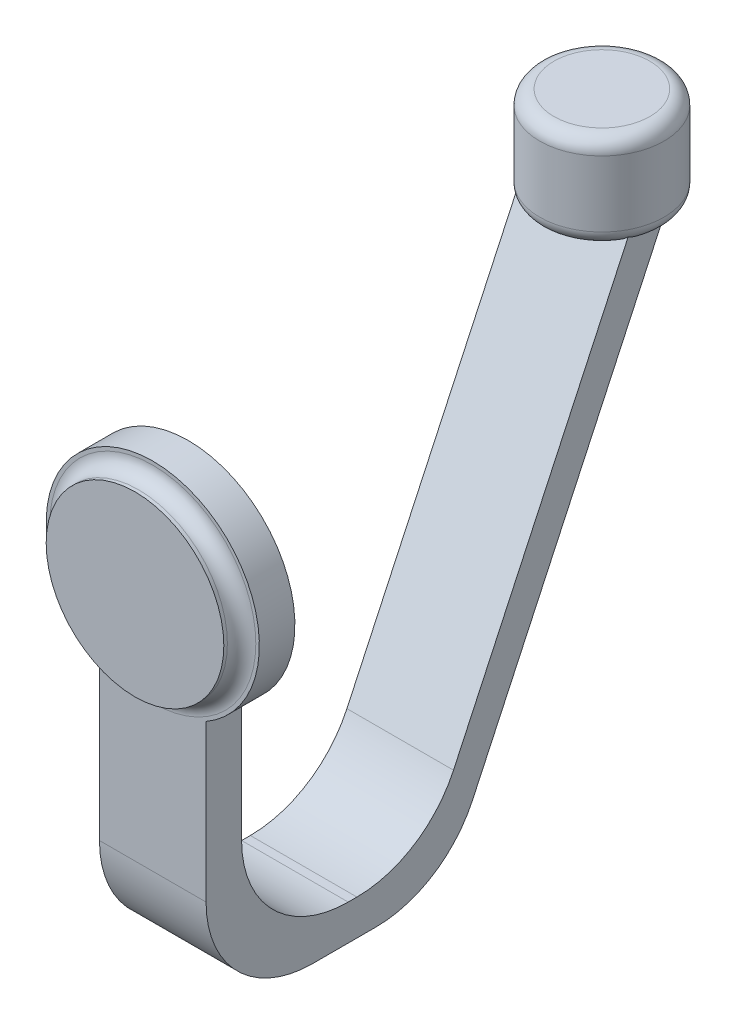
ISO-10303-21;
HEADER;
FILE_DESCRIPTION(('STEP AP214'),'2;1');
FILE_NAME('part.step','',(''),(''),'','','');
FILE_SCHEMA(('AUTOMOTIVE_DESIGN { 1 0 10303 214 1 1 1 1 }'));
ENDSEC;
DATA;
#1=APPLICATION_CONTEXT('core data for automotive mechanical design processes');
#2=APPLICATION_PROTOCOL_DEFINITION('international standard','automotive_design',2000,#1);
#3=PRODUCT_CONTEXT('',#1,'mechanical');
#4=PRODUCT('Part','Part','',(#3));
#5=PRODUCT_RELATED_PRODUCT_CATEGORY('part','',(#4));
#6=PRODUCT_DEFINITION_FORMATION('','',#4);
#7=PRODUCT_DEFINITION_CONTEXT('part definition',#1,'design');
#8=PRODUCT_DEFINITION('design','',#6,#7);
#9=PRODUCT_DEFINITION_SHAPE('','',#8);
#10=(LENGTH_UNIT() NAMED_UNIT(*) SI_UNIT(.MILLI.,.METRE.));
#11=(NAMED_UNIT(*) PLANE_ANGLE_UNIT() SI_UNIT($,.RADIAN.));
#12=(NAMED_UNIT(*) SI_UNIT($,.STERADIAN.) SOLID_ANGLE_UNIT());
#13=UNCERTAINTY_MEASURE_WITH_UNIT(LENGTH_MEASURE(1.E-05),#10,'distance_accuracy_value','');
#14=(GEOMETRIC_REPRESENTATION_CONTEXT(3) GLOBAL_UNCERTAINTY_ASSIGNED_CONTEXT((#13)) GLOBAL_UNIT_ASSIGNED_CONTEXT((#10,
#11,#12)) REPRESENTATION_CONTEXT('',''));
#15=CARTESIAN_POINT('',(0.,0.,0.));
#16=DIRECTION('',(0.,0.,1.));
#17=DIRECTION('',(1.,0.,0.));
#18=AXIS2_PLACEMENT_3D('',#15,#16,#17);
#19=CARTESIAN_POINT('',(470.,57.5,85.));
#20=DIRECTION('',(0.,1.,0.));
#21=DIRECTION('',(0.,0.,1.));
#22=AXIS2_PLACEMENT_3D('',#19,#20,#21);
#23=PLANE('',#22);
#24=CARTESIAN_POINT('',(0.,57.5,0.));
#25=DIRECTION('',(0.,1.,0.));
#26=DIRECTION('',(0.,0.,1.));
#27=AXIS2_PLACEMENT_3D('',#24,#25,#26);
#28=CIRCLE('',#27,13.5);
#29=CARTESIAN_POINT('',(0.,57.5,13.5));
#30=VERTEX_POINT('',#29);
#31=EDGE_CURVE('E241',#30,#30,#28,.T.);
#32=ORIENTED_EDGE('',*,*,#31,.T.);
#33=EDGE_LOOP('',(#32));
#34=FACE_BOUND('',#33,.T.);
#35=ADVANCED_FACE('F40',(#34),#23,.T.);
#36=CARTESIAN_POINT('',(0.,53.5,0.));
#37=DIRECTION('',(0.,1.,0.));
#38=DIRECTION('',(0.,0.,1.));
#39=AXIS2_PLACEMENT_3D('',#36,#37,#38);
#40=TOROIDAL_SURFACE('',#39,13.5,4.);
#41=CARTESIAN_POINT('',(0.,53.5,0.));
#42=DIRECTION('',(0.,1.,0.));
#43=DIRECTION('',(0.,0.,1.));
#44=AXIS2_PLACEMENT_3D('',#41,#42,#43);
#45=CIRCLE('',#44,17.5);
#46=CARTESIAN_POINT('',(0.,53.5,17.5));
#47=VERTEX_POINT('',#46);
#48=EDGE_CURVE('E247',#47,#47,#45,.F.);
#49=ORIENTED_EDGE('',*,*,#48,.F.);
#50=EDGE_LOOP('',(#49));
#51=FACE_BOUND('',#50,.T.);
#52=ORIENTED_EDGE('',*,*,#31,.F.);
#53=EDGE_LOOP('',(#52));
#54=FACE_BOUND('',#53,.T.);
#55=ADVANCED_FACE('F355',(#51,#54),#40,.T.);
#56=CARTESIAN_POINT('',(0.,106.997474683058,0.));
#57=DIRECTION('',(0.,-1.,0.));
#58=DIRECTION('',(0.,0.,-1.));
#59=AXIS2_PLACEMENT_3D('',#56,#57,#58);
#60=CYLINDRICAL_SURFACE('',#59,17.5);
#61=ORIENTED_EDGE('',*,*,#48,.T.);
#62=EDGE_LOOP('',(#61));
#63=FACE_BOUND('',#62,.T.);
#64=CARTESIAN_POINT('',(0.,34.9681867725985,0.));
#65=DIRECTION('',(0.,1.,0.));
#66=DIRECTION('',(0.,0.,1.));
#67=AXIS2_PLACEMENT_3D('',#64,#65,#66);
#68=CIRCLE('',#67,17.5);
#69=CARTESIAN_POINT('',(0.,34.9681867725985,17.5));
#70=VERTEX_POINT('',#69);
#71=EDGE_CURVE('E244',#70,#70,#68,.T.);
#72=ORIENTED_EDGE('',*,*,#71,.T.);
#73=EDGE_LOOP('',(#72));
#74=FACE_BOUND('',#73,.T.);
#75=ADVANCED_FACE('F361',(#63,#74),#60,.T.);
#76=CARTESIAN_POINT('',(0.,30.9681867725985,0.));
#77=DIRECTION('',(0.,1.,0.));
#78=DIRECTION('',(0.,0.,1.));
#79=AXIS2_PLACEMENT_3D('',#76,#77,#78);
#80=PLANE('',#79);
#81=DIRECTION('',(-1.,0.,0.));
#82=VECTOR('',#81,1.);
#83=CARTESIAN_POINT('',(164.009461365782,30.9681867725985,8.42853153326353));
#84=LINE('',#83,#82);
#85=CARTESIAN_POINT('',(10.545608384194,30.9681867725985,8.42853153326353));
#86=VERTEX_POINT('',#85);
#87=CARTESIAN_POINT('',(-10.545608384194,30.9681867725985,8.42853153326353));
#88=VERTEX_POINT('',#87);
#89=EDGE_CURVE('E183',#86,#88,#84,.T.);
#90=ORIENTED_EDGE('',*,*,#89,.F.);
#91=CARTESIAN_POINT('',(0.,30.9681867725985,0.));
#92=DIRECTION('',(0.,1.,0.));
#93=DIRECTION('',(0.,0.,1.));
#94=AXIS2_PLACEMENT_3D('',#91,#92,#93);
#95=CIRCLE('',#94,13.5);
#96=EDGE_CURVE('E252',#86,#88,#95,.F.);
#97=ORIENTED_EDGE('',*,*,#96,.T.);
#98=EDGE_LOOP('',(#90,#97));
#99=FACE_BOUND('',#98,.T.);
#100=ADVANCED_FACE('F493',(#99),#80,.F.);
#101=DIRECTION('',(-1.,0.,0.));
#102=VECTOR('',#101,1.);
#103=CARTESIAN_POINT('',(164.009461365782,30.9681867725985,-1.57146846673646));
#104=LINE('',#103,#102);
#105=CARTESIAN_POINT('',(13.4082245975391,30.9681867725985,-1.57146846673646));
#106=VERTEX_POINT('',#105);
#107=CARTESIAN_POINT('',(-13.4082245975391,30.9681867725985,-1.57146846673646));
#108=VERTEX_POINT('',#107);
#109=EDGE_CURVE('E179',#106,#108,#104,.T.);
#110=ORIENTED_EDGE('',*,*,#109,.T.);
#111=CARTESIAN_POINT('',(0.,30.9681867725985,0.));
#112=DIRECTION('',(0.,1.,0.));
#113=DIRECTION('',(0.,0.,1.));
#114=AXIS2_PLACEMENT_3D('',#111,#112,#113);
#115=CIRCLE('',#114,13.5);
#116=EDGE_CURVE('E250',#108,#106,#115,.F.);
#117=ORIENTED_EDGE('',*,*,#116,.T.);
#118=EDGE_LOOP('',(#110,#117));
#119=FACE_BOUND('',#118,.T.);
#120=ADVANCED_FACE('F332',(#119),#80,.F.);
#121=CARTESIAN_POINT('',(0.,34.9681867725985,0.));
#122=DIRECTION('',(0.,1.,0.));
#123=DIRECTION('',(0.,0.,1.));
#124=AXIS2_PLACEMENT_3D('',#121,#122,#123);
#125=TOROIDAL_SURFACE('',#124,13.5,4.);
#126=CARTESIAN_POINT('',(-10.545608384194,30.9681867725985,8.42853153326353));
#127=CARTESIAN_POINT('',(-10.7152312089002,30.968207326589,8.42852194878039));
#128=CARTESIAN_POINT('',(-10.884761049705,30.9747698955943,8.42546177259605));
#129=CARTESIAN_POINT('',(-11.2226090984357,31.0007018072022,8.41336952362265));
#130=CARTESIAN_POINT('',(-11.3909274322339,31.0200697993582,8.40433808055725));
#131=CARTESIAN_POINT('',(-11.8933065331305,31.0970794834363,8.36842787511953));
#132=CARTESIAN_POINT('',(-12.2240465200114,31.1736245117423,8.33273434222677));
#133=CARTESIAN_POINT('',(-12.8716683239122,31.3765193566267,8.23812292225702));
#134=CARTESIAN_POINT('',(-13.1882915739955,31.5035508755718,8.17888715214582));
#135=CARTESIAN_POINT('',(-13.6411038903215,31.7291856533687,8.07367192731301));
#136=CARTESIAN_POINT('',(-13.7882449153386,31.8101660781055,8.03591013509759));
#137=CARTESIAN_POINT('',(-14.0741182449924,31.9834781989561,7.95509336589391));
#138=CARTESIAN_POINT('',(-14.2128545512437,32.0758044287277,7.91204093790281));
#139=CARTESIAN_POINT('',(-14.4636220561541,32.25893237927,7.82664697214274));
#140=CARTESIAN_POINT('',(-14.5768074472217,32.3484394096639,7.78490915841131));
#141=CARTESIAN_POINT('',(-14.7948501167143,32.535334883347,7.69775836775838));
#142=CARTESIAN_POINT('',(-14.8997113191615,32.6327195688692,7.6523471431124));
#143=CARTESIAN_POINT('',(-15.,32.7338768594451,7.60517672383865));
#144=B_SPLINE_CURVE_WITH_KNOTS('',3,(#126,#127,#128,#129,#130,#131,#132,#133,#134,#135,#136,
#137,#138,#139,#140,#141,#142,#143),.UNSPECIFIED.,.F.,.F.,(4,2,2,2,2,2,2,2,4),(0.,
0.50854328375544,1.01703294561259,2.03621919814531,3.06966204407253,3.58555545223124,
4.10120127335572,4.55137952087851,5.00134427839677),.UNSPECIFIED.);
#145=CARTESIAN_POINT('',(-15.,32.7338768594451,7.60517672383865));
#146=VERTEX_POINT('',#145);
#147=EDGE_CURVE('E261',#88,#146,#144,.T.);
#148=ORIENTED_EDGE('',*,*,#147,.F.);
#149=ORIENTED_EDGE('',*,*,#96,.F.);
#150=CARTESIAN_POINT('',(15.,32.7338768594451,7.60517672383865));
#151=CARTESIAN_POINT('',(14.8860200659042,32.6189035831155,7.65878964307428));
#152=CARTESIAN_POINT('',(14.7661270916275,32.5088065401462,7.71012873735111));
#153=CARTESIAN_POINT('',(14.5158803655626,32.2989606039281,7.80798150444231));
#154=CARTESIAN_POINT('',(14.3855317171552,32.1992067160765,7.85449750627825));
#155=CARTESIAN_POINT('',(14.1158702449399,32.0107010252015,7.94239915353906));
#156=CARTESIAN_POINT('',(13.9765740848561,31.9219296222046,7.98379393858168));
#157=CARTESIAN_POINT('',(13.6900897992569,31.7556076000142,8.06135117124888));
#158=CARTESIAN_POINT('',(13.542901182616,31.6780576802153,8.09751329274041));
#159=CARTESIAN_POINT('',(13.1063064996948,31.4699455508602,8.19455757241362));
#160=CARTESIAN_POINT('',(12.8079981462975,31.3543964244426,8.2484390149553));
#161=CARTESIAN_POINT('',(12.1953610147218,31.1671507643174,8.33575310022793));
#162=CARTESIAN_POINT('',(11.8810436391301,31.0954234784737,8.36920008291553));
#163=CARTESIAN_POINT('',(11.3945937837726,31.0205159704723,8.40413002754991));
#164=CARTESIAN_POINT('',(11.2253688866602,31.0009612586506,8.41324853942536));
#165=CARTESIAN_POINT('',(10.8859931530864,30.9748175546796,8.42543954879957));
#166=CARTESIAN_POINT('',(10.7158443451619,30.9682068755625,8.4285221590975));
#167=CARTESIAN_POINT('',(10.5456083841939,30.9681867725985,8.42853153326353));
#168=B_SPLINE_CURVE_WITH_KNOTS('',3,(#150,#151,#152,#153,#154,#155,#156,#157,#158,#159,#160,
#161,#162,#163,#164,#165,#166,#167),.UNSPECIFIED.,.F.,.F.,(4,2,2,2,2,2,2,2,4),(0.,
0.511365533940272,1.02248297331922,1.53267466552046,2.04289814244638,3.01178423787931,
3.97998963064112,4.49123985370231,5.0016327715614),.UNSPECIFIED.);
#169=CARTESIAN_POINT('',(15.,32.7338768594451,7.60517672383865));
#170=VERTEX_POINT('',#169);
#171=EDGE_CURVE('E11',#170,#86,#168,.T.);
#172=ORIENTED_EDGE('',*,*,#171,.F.);
#173=CARTESIAN_POINT('',(15.,31.3017294395276,-1.72700196664695));
#174=CARTESIAN_POINT('',(15.,31.2946542438076,-1.58505761140885));
#175=CARTESIAN_POINT('',(15.,31.2885545747367,-1.44306765861311));
#176=CARTESIAN_POINT('',(15.,31.2781857632575,-1.15902399239379));
#177=CARTESIAN_POINT('',(15.,31.2739165780865,-1.01697028053732));
#178=CARTESIAN_POINT('',(15.,31.2636729787802,-0.59072119923288));
#179=CARTESIAN_POINT('',(15.,31.260263651425,-0.306461374374114));
#180=CARTESIAN_POINT('',(15.,31.259923769649,0.263617927047029));
#181=CARTESIAN_POINT('',(15.,31.2630288604999,0.549437404691567));
#182=CARTESIAN_POINT('',(15.,31.2761122053653,1.12091738865747));
#183=CARTESIAN_POINT('',(15.,31.2860902583001,1.40657789938497));
#184=CARTESIAN_POINT('',(15.,31.313417061035,1.96717594736239));
#185=CARTESIAN_POINT('',(15.,31.3304854881255,2.24212678805273));
#186=CARTESIAN_POINT('',(15.,31.3734490546799,2.79133253246845));
#187=CARTESIAN_POINT('',(15.,31.3993433450627,3.06558750058339));
#188=CARTESIAN_POINT('',(15.,31.4620678566855,3.61247112621148));
#189=CARTESIAN_POINT('',(15.,31.4988821622812,3.88510156556343));
#190=CARTESIAN_POINT('',(15.,31.5863034340388,4.4281101068495));
#191=CARTESIAN_POINT('',(15.,31.636905221332,4.69848901528545));
#192=CARTESIAN_POINT('',(15.,31.7471399435721,5.19713214714225));
#193=CARTESIAN_POINT('',(15.,31.8044553446754,5.42590276478388));
#194=CARTESIAN_POINT('',(15.,31.9348028343335,5.87869496916715));
#195=CARTESIAN_POINT('',(15.,32.0078115328978,6.10272308433633));
#196=CARTESIAN_POINT('',(15.,32.1324295460294,6.4349996810594));
#197=CARTESIAN_POINT('',(15.,32.1768769802978,6.54594607314739));
#198=CARTESIAN_POINT('',(15.,32.2712912629136,6.76544058473568));
#199=CARTESIAN_POINT('',(15.,32.3212564068328,6.87398943247663));
#200=CARTESIAN_POINT('',(15.,32.427569547536,7.08863543611227));
#201=CARTESIAN_POINT('',(15.,32.4839488831823,7.19471721293825));
#202=CARTESIAN_POINT('',(15.,32.6035926124073,7.40306754804488));
#203=CARTESIAN_POINT('',(15.,32.6668645529323,7.50533175852156));
#204=CARTESIAN_POINT('',(15.,32.7338768594451,7.60517672383865));
#205=B_SPLINE_CURVE_WITH_KNOTS('',3,(#173,#174,#175,#176,#177,#178,#179,#180,#181,#182,#183,
#184,#185,#186,#187,#188,#189,#190,#191,#192,#193,#194,#195,#196,#197,#198,#199,#200,#201,#202,
#203,#204),.UNSPECIFIED.,.F.,.F.,(4,2,2,2,2,2,2,2,2,2,2,2,2,2,2,4),(0.,0.426353272020604,
0.852696583283366,1.70545373890509,2.56288913542098,3.42029944732787,4.24662618178154,
5.07287344295641,5.89792233781041,6.72266175312848,7.42976812666328,8.13582781588574,
8.49425990841383,8.8525815888568,9.21273595160975,9.57328870035811),.UNSPECIFIED.);
#206=CARTESIAN_POINT('',(15.,31.3017294395277,-1.72700196664696));
#207=VERTEX_POINT('',#206);
#208=EDGE_CURVE('E52',#207,#170,#205,.T.);
#209=ORIENTED_EDGE('',*,*,#208,.F.);
#210=CARTESIAN_POINT('',(13.4082245975391,30.9681867725985,-1.57146846673646));
#211=CARTESIAN_POINT('',(13.5109524327348,30.9681697069459,-1.57146050889192));
#212=CARTESIAN_POINT('',(13.6136871358486,30.9720899175039,-1.57328853309671));
#213=CARTESIAN_POINT('',(13.8184745141127,30.9877937604101,-1.58061135530634));
#214=CARTESIAN_POINT('',(13.9205268137176,30.9995814119703,-1.58610802750053));
#215=CARTESIAN_POINT('',(14.1212372411173,31.0307127723056,-1.60062481923369));
#216=CARTESIAN_POINT('',(14.2199230870676,31.0499098520753,-1.6095765645445));
#217=CARTESIAN_POINT('',(14.4151185043218,31.0957293427794,-1.63094254395256));
#218=CARTESIAN_POINT('',(14.5116293402763,31.1223473118243,-1.64335470676273));
#219=CARTESIAN_POINT('',(14.6735939264869,31.1738303692698,-1.66736165071482));
#220=CARTESIAN_POINT('',(14.7397619719342,31.1968699735062,-1.6781051946111));
#221=CARTESIAN_POINT('',(14.8709338380603,31.2465950604341,-1.70129238344803));
#222=CARTESIAN_POINT('',(14.9359267925488,31.27330409154,-1.71374700919461));
#223=CARTESIAN_POINT('',(15.0000000000001,31.3017294395276,-1.72700196664695));
#224=B_SPLINE_CURVE_WITH_KNOTS('',3,(#210,#211,#212,#213,#214,#215,#216,#217,#218,#219,#220,
#221,#222,#223),.UNSPECIFIED.,.F.,.F.,(4,2,2,2,2,2,4),(0.,0.308103093431711,0.616363707011656,
0.918813264753393,1.22108217383069,1.4336171056132,1.64758591380508),.UNSPECIFIED.);
#225=EDGE_CURVE('E312',#106,#207,#224,.T.);
#226=ORIENTED_EDGE('',*,*,#225,.F.);
#227=ORIENTED_EDGE('',*,*,#116,.F.);
#228=CARTESIAN_POINT('',(-15.,31.3017294395276,-1.72700196664695));
#229=CARTESIAN_POINT('',(-14.9077164653574,31.2607754461643,-1.70790480590959));
#230=CARTESIAN_POINT('',(-14.8134998924318,31.2233935846295,-1.69047335759981));
#231=CARTESIAN_POINT('',(-14.6218988117471,31.1560312657338,-1.65906179242768));
#232=CARTESIAN_POINT('',(-14.5245142998769,31.1260508179786,-1.64508168004451));
#233=CARTESIAN_POINT('',(-14.3291263367313,31.0742393057946,-1.62092157513252));
#234=CARTESIAN_POINT('',(-14.2311687922473,31.0522658736621,-1.61067519545319));
#235=CARTESIAN_POINT('',(-14.0335766741488,31.0158391398089,-1.5936891304959));
#236=CARTESIAN_POINT('',(-13.9339423952548,31.0013845304625,-1.58694883546201));
#237=CARTESIAN_POINT('',(-13.7632047534185,30.9831986592476,-1.57846862444429));
#238=CARTESIAN_POINT('',(-13.6923408265093,30.9775629879052,-1.57584066773849));
#239=CARTESIAN_POINT('',(-13.5503945191005,30.97005629394,-1.5723402388551));
#240=CARTESIAN_POINT('',(-13.4793122208841,30.9681839945673,-1.57146717131924));
#241=CARTESIAN_POINT('',(-13.4082245975392,30.9681867725985,-1.57146846673648));
#242=B_SPLINE_CURVE_WITH_KNOTS('',3,(#228,#229,#230,#231,#232,#233,#234,#235,#236,#237,#238,
#239,#240,#241),.UNSPECIFIED.,.F.,.F.,(4,2,2,2,2,2,4),(0.,0.308171799363888,0.616343998676297,
0.918733285358422,1.22106996482355,1.43436363094255,1.64758492349183),.UNSPECIFIED.);
#243=CARTESIAN_POINT('',(-15.,31.3017294395276,-1.72700196664693));
#244=VERTEX_POINT('',#243);
#245=EDGE_CURVE('E316',#244,#108,#242,.T.);
#246=ORIENTED_EDGE('',*,*,#245,.F.);
#247=CARTESIAN_POINT('',(-15.,32.7338768594451,7.60517672383865));
#248=CARTESIAN_POINT('',(-15.,32.6862002315018,7.53416495154672));
#249=CARTESIAN_POINT('',(-15.,32.6404231023762,7.4619123259332));
#250=CARTESIAN_POINT('',(-15.,32.5524461563186,7.31531142330901));
#251=CARTESIAN_POINT('',(-15.,32.51024438764,7.24096431957436));
#252=CARTESIAN_POINT('',(-15.,32.3888039813336,7.01562866338823));
#253=CARTESIAN_POINT('',(-15.,32.3144869566062,6.86197595558332));
#254=CARTESIAN_POINT('',(-15.,32.1780826120228,6.55152502755692));
#255=CARTESIAN_POINT('',(-15.,32.1158647217561,6.39478314726917));
#256=CARTESIAN_POINT('',(-15.,32.0010682301106,6.07777298548782));
#257=CARTESIAN_POINT('',(-15.,31.9484933421097,5.91750337201349));
#258=CARTESIAN_POINT('',(-15.,31.829094572106,5.519117540483));
#259=CARTESIAN_POINT('',(-15.,31.7670676362749,5.27956954591452));
#260=CARTESIAN_POINT('',(-15.,31.6574686874191,4.79723146085827));
#261=CARTESIAN_POINT('',(-15.,31.6098996051803,4.55444072342565));
#262=CARTESIAN_POINT('',(-15.,31.5263666182455,4.06642409714968));
#263=CARTESIAN_POINT('',(-15.,31.4904252762013,3.82119441442788));
#264=CARTESIAN_POINT('',(-15.,31.4280486196363,3.32958061765078));
#265=CARTESIAN_POINT('',(-15.,31.4016124106377,3.08319661443418));
#266=CARTESIAN_POINT('',(-15.,31.3562159310149,2.58659502530944));
#267=CARTESIAN_POINT('',(-15.,31.3373550618984,2.33636854980331));
#268=CARTESIAN_POINT('',(-15.,31.3062454931197,1.83550867187382));
#269=CARTESIAN_POINT('',(-15.,31.2939969624949,1.58487525921181));
#270=CARTESIAN_POINT('',(-15.,31.275201746329,1.08365883993128));
#271=CARTESIAN_POINT('',(-15.,31.2686492079694,0.83307604671023));
#272=CARTESIAN_POINT('',(-15.,31.2607116465589,0.331840115470572));
#273=CARTESIAN_POINT('',(-15.,31.2593263881142,0.0811869811765705));
#274=CARTESIAN_POINT('',(-15.,31.2610725776303,-0.299902802911347));
#275=CARTESIAN_POINT('',(-15.,31.262356695702,-0.430350457666127));
#276=CARTESIAN_POINT('',(-15.,31.2663309818546,-0.691232158290881));
#277=CARTESIAN_POINT('',(-15.,31.269021227218,-0.821666203018683));
#278=CARTESIAN_POINT('',(-15.,31.2758298152273,-1.08128795248768));
#279=CARTESIAN_POINT('',(-15.,31.2799346951762,-1.21047600772902));
#280=CARTESIAN_POINT('',(-15.,31.2896673672442,-1.46878966613489));
#281=CARTESIAN_POINT('',(-15.,31.2952951017424,-1.59791527147723));
#282=CARTESIAN_POINT('',(-15.,31.3017294395276,-1.72700196664696));
#283=B_SPLINE_CURVE_WITH_KNOTS('',3,(#247,#248,#249,#250,#251,#252,#253,#254,#255,#256,#257,
#258,#259,#260,#261,#262,#263,#264,#265,#266,#267,#268,#269,#270,#271,#272,#273,#274,#275,#276,
#277,#278,#279,#280,#281,#282),.UNSPECIFIED.,.F.,.F.,(4,2,2,2,2,2,2,2,2,2,2,2,2,2,2,2,2,4),(0.,
0.256520464114686,0.512899982159367,1.02433610830708,1.52990251897129,2.03566320892495,
2.77739956915177,3.51928618839149,4.26260386021556,5.00585156402851,5.7585561364535,
6.51127995005916,7.26322939794036,8.01514459056622,8.40650037911286,8.79787767935193,
9.18562875119175,9.57336515356034),.UNSPECIFIED.);
#284=EDGE_CURVE('E267',#146,#244,#283,.T.);
#285=ORIENTED_EDGE('',*,*,#284,.F.);
#286=EDGE_LOOP('',(#148,#149,#172,#209,#226,#227,#246,#285));
#287=FACE_BOUND('',#286,.T.);
#288=ORIENTED_EDGE('',*,*,#71,.F.);
#289=EDGE_LOOP('',(#288));
#290=FACE_BOUND('',#289,.T.);
#291=ADVANCED_FACE('F273',(#287,#290),#125,.T.);
#292=CARTESIAN_POINT('',(164.009461365782,30.9681867725985,8.42853153326353));
#293=DIRECTION('',(0.,0.422618261740697,0.906307787036651));
#294=DIRECTION('',(0.,-0.906307787036651,0.422618261740697));
#295=AXIS2_PLACEMENT_3D('',#292,#293,#294);
#296=PLANE('',#295);
#297=DIRECTION('',(0.,0.906307787036651,-0.422618261740697));
#298=VECTOR('',#297,1.);
#299=CARTESIAN_POINT('',(-15.,30.9681867725985,8.42853153326353));
#300=LINE('',#299,#298);
#301=CARTESIAN_POINT('',(-15.,-72.6785478522209,56.7597976315753));
#302=VERTEX_POINT('',#301);
#303=EDGE_CURVE('E177',#302,#146,#300,.T.);
#304=ORIENTED_EDGE('',*,*,#303,.F.);
#305=DIRECTION('',(-1.,0.,0.));
#306=VECTOR('',#305,1.);
#307=CARTESIAN_POINT('',(164.009461365782,-72.6785478522209,56.7597976315753));
#308=LINE('',#307,#306);
#309=CARTESIAN_POINT('',(15.,-72.6785478522209,56.7597976315754));
#310=VERTEX_POINT('',#309);
#311=EDGE_CURVE('E231',#302,#310,#308,.F.);
#312=ORIENTED_EDGE('',*,*,#311,.T.);
#313=DIRECTION('',(0.,-0.906307787036651,0.422618261740697));
#314=VECTOR('',#313,1.);
#315=CARTESIAN_POINT('',(15.,30.9681867725985,8.42853153326353));
#316=LINE('',#315,#314);
#317=EDGE_CURVE('E58',#170,#310,#316,.T.);
#318=ORIENTED_EDGE('',*,*,#317,.F.);
#319=ORIENTED_EDGE('',*,*,#171,.T.);
#320=ORIENTED_EDGE('',*,*,#89,.T.);
#321=ORIENTED_EDGE('',*,*,#147,.T.);
#322=EDGE_LOOP('',(#304,#312,#318,#319,#320,#321));
#323=FACE_BOUND('',#322,.T.);
#324=ADVANCED_FACE('F276',(#323),#296,.T.);
#325=CARTESIAN_POINT('',(15.,-60.,83.9490312426749));
#326=DIRECTION('',(-1.,0.,0.));
#327=DIRECTION('',(0.,0.,1.));
#328=AXIS2_PLACEMENT_3D('',#325,#326,#327);
#329=CYLINDRICAL_SURFACE('',#328,30.);
#330=CARTESIAN_POINT('',(15.,-60.,83.9490312426749));
#331=DIRECTION('',(-1.,0.,0.));
#332=DIRECTION('',(0.,0.,1.));
#333=AXIS2_PLACEMENT_3D('',#330,#331,#332);
#334=CIRCLE('',#333,30.);
#335=CARTESIAN_POINT('',(15.,-90.,83.9490312426749));
#336=VERTEX_POINT('',#335);
#337=EDGE_CURVE('E239',#310,#336,#334,.T.);
#338=ORIENTED_EDGE('',*,*,#337,.F.);
#339=ORIENTED_EDGE('',*,*,#311,.F.);
#340=CARTESIAN_POINT('',(-15.,-60.,83.9490312426749));
#341=DIRECTION('',(1.,0.,0.));
#342=DIRECTION('',(0.,0.,-1.));
#343=AXIS2_PLACEMENT_3D('',#340,#341,#342);
#344=CIRCLE('',#343,30.);
#345=CARTESIAN_POINT('',(-15.,-90.,83.9490312426749));
#346=VERTEX_POINT('',#345);
#347=EDGE_CURVE('E237',#346,#302,#344,.T.);
#348=ORIENTED_EDGE('',*,*,#347,.F.);
#349=DIRECTION('',(-1.,0.,0.));
#350=VECTOR('',#349,1.);
#351=CARTESIAN_POINT('',(15.,-90.,83.9490312426749));
#352=LINE('',#351,#350);
#353=EDGE_CURVE('E223',#336,#346,#352,.T.);
#354=ORIENTED_EDGE('',*,*,#353,.F.);
#355=EDGE_LOOP('',(#338,#339,#348,#354));
#356=FACE_BOUND('',#355,.T.);
#357=ADVANCED_FACE('F281',(#356),#329,.F.);
#358=CARTESIAN_POINT('',(15.,-90.,59.5));
#359=DIRECTION('',(0.,-1.,0.));
#360=DIRECTION('',(0.,0.,-1.));
#361=AXIS2_PLACEMENT_3D('',#358,#359,#360);
#362=PLANE('',#361);
#363=DIRECTION('',(0.,0.,1.));
#364=VECTOR('',#363,1.);
#365=CARTESIAN_POINT('',(-15.,-90.,59.5));
#366=LINE('',#365,#364);
#367=CARTESIAN_POINT('',(-15.,-90.,86.4));
#368=VERTEX_POINT('',#367);
#369=EDGE_CURVE('E192',#346,#368,#366,.T.);
#370=ORIENTED_EDGE('',*,*,#369,.T.);
#371=DIRECTION('',(1.,0.,0.));
#372=VECTOR('',#371,1.);
#373=CARTESIAN_POINT('',(15.,-90.,86.4));
#374=LINE('',#373,#372);
#375=CARTESIAN_POINT('',(15.,-90.,86.4));
#376=VERTEX_POINT('',#375);
#377=EDGE_CURVE('E226',#368,#376,#374,.T.);
#378=ORIENTED_EDGE('',*,*,#377,.T.);
#379=DIRECTION('',(0.,0.,1.));
#380=VECTOR('',#379,1.);
#381=CARTESIAN_POINT('',(15.,-90.,59.5));
#382=LINE('',#381,#380);
#383=EDGE_CURVE('E189',#336,#376,#382,.T.);
#384=ORIENTED_EDGE('',*,*,#383,.F.);
#385=ORIENTED_EDGE('',*,*,#353,.T.);
#386=EDGE_LOOP('',(#370,#378,#384,#385));
#387=FACE_BOUND('',#386,.T.);
#388=ADVANCED_FACE('F285',(#387),#362,.F.);
#389=CARTESIAN_POINT('',(15.,-60.,86.4));
#390=DIRECTION('',(1.,0.,0.));
#391=DIRECTION('',(0.,0.,-1.));
#392=AXIS2_PLACEMENT_3D('',#389,#390,#391);
#393=CYLINDRICAL_SURFACE('',#392,30.);
#394=CARTESIAN_POINT('',(-15.,-60.,86.4));
#395=DIRECTION('',(1.,0.,0.));
#396=DIRECTION('',(0.,0.,-1.));
#397=AXIS2_PLACEMENT_3D('',#394,#395,#396);
#398=CIRCLE('',#397,30.);
#399=CARTESIAN_POINT('',(-15.,-60.,116.4));
#400=VERTEX_POINT('',#399);
#401=EDGE_CURVE('E235',#400,#368,#398,.T.);
#402=ORIENTED_EDGE('',*,*,#401,.F.);
#403=DIRECTION('',(1.,0.,0.));
#404=VECTOR('',#403,1.);
#405=CARTESIAN_POINT('',(0.,-60.,116.4));
#406=LINE('',#405,#404);
#407=CARTESIAN_POINT('',(15.,-60.,116.4));
#408=VERTEX_POINT('',#407);
#409=EDGE_CURVE('E229',#408,#400,#406,.F.);
#410=ORIENTED_EDGE('',*,*,#409,.F.);
#411=CARTESIAN_POINT('',(15.,-60.,86.4));
#412=DIRECTION('',(-1.,0.,0.));
#413=DIRECTION('',(0.,0.,1.));
#414=AXIS2_PLACEMENT_3D('',#411,#412,#413);
#415=CIRCLE('',#414,30.);
#416=EDGE_CURVE('E233',#376,#408,#415,.T.);
#417=ORIENTED_EDGE('',*,*,#416,.F.);
#418=ORIENTED_EDGE('',*,*,#377,.F.);
#419=EDGE_LOOP('',(#402,#410,#417,#418));
#420=FACE_BOUND('',#419,.T.);
#421=ADVANCED_FACE('F289',(#420),#393,.F.);
#422=CARTESIAN_POINT('',(0.,0.,116.4));
#423=DIRECTION('',(0.,0.,-1.));
#424=DIRECTION('',(-1.,0.,0.));
#425=AXIS2_PLACEMENT_3D('',#422,#423,#424);
#426=PLANE('',#425);
#427=DIRECTION('',(0.,1.,0.));
#428=VECTOR('',#427,1.);
#429=CARTESIAN_POINT('',(15.,-100.,116.4));
#430=LINE('',#429,#428);
#431=CARTESIAN_POINT('',(15.,-25.9807621135332,116.4));
#432=VERTEX_POINT('',#431);
#433=EDGE_CURVE('E201',#408,#432,#430,.T.);
#434=ORIENTED_EDGE('',*,*,#433,.F.);
#435=ORIENTED_EDGE('',*,*,#409,.T.);
#436=DIRECTION('',(0.,1.,0.));
#437=VECTOR('',#436,1.);
#438=CARTESIAN_POINT('',(-15.,-100.,116.4));
#439=LINE('',#438,#437);
#440=CARTESIAN_POINT('',(-15.,-25.9807621135332,116.4));
#441=VERTEX_POINT('',#440);
#442=EDGE_CURVE('E157',#400,#441,#439,.T.);
#443=ORIENTED_EDGE('',*,*,#442,.T.);
#444=CARTESIAN_POINT('',(0.,0.,116.4));
#445=DIRECTION('',(0.,0.,-1.));
#446=DIRECTION('',(-1.,0.,0.));
#447=AXIS2_PLACEMENT_3D('',#444,#445,#446);
#448=CIRCLE('',#447,30.0000000000001);
#449=EDGE_CURVE('E165',#441,#432,#448,.T.);
#450=ORIENTED_EDGE('',*,*,#449,.T.);
#451=EDGE_LOOP('',(#434,#435,#443,#450));
#452=FACE_BOUND('',#451,.T.);
#453=ADVANCED_FACE('F294',(#452),#426,.T.);
#454=CARTESIAN_POINT('',(470.,-100.,85.));
#455=DIRECTION('',(0.,-1.,0.));
#456=DIRECTION('',(0.,0.,-1.));
#457=AXIS2_PLACEMENT_3D('',#454,#455,#456);
#458=PLANE('',#457);
#459=DIRECTION('',(0.,0.,-1.));
#460=VECTOR('',#459,1.);
#461=CARTESIAN_POINT('',(-15.,-100.,116.4));
#462=LINE('',#461,#460);
#463=CARTESIAN_POINT('',(-15.,-100.,96.4));
#464=VERTEX_POINT('',#463);
#465=CARTESIAN_POINT('',(-15.,-100.,78.6121078242249));
#466=VERTEX_POINT('',#465);
#467=EDGE_CURVE('E198',#464,#466,#462,.T.);
#468=ORIENTED_EDGE('',*,*,#467,.T.);
#469=DIRECTION('',(-1.,0.,0.));
#470=VECTOR('',#469,1.);
#471=CARTESIAN_POINT('',(470.,-100.,78.6121078242249));
#472=LINE('',#471,#470);
#473=CARTESIAN_POINT('',(15.,-100.,78.6121078242249));
#474=VERTEX_POINT('',#473);
#475=EDGE_CURVE('E215',#466,#474,#472,.F.);
#476=ORIENTED_EDGE('',*,*,#475,.T.);
#477=DIRECTION('',(0.,0.,1.));
#478=VECTOR('',#477,1.);
#479=CARTESIAN_POINT('',(15.,-100.,116.4));
#480=LINE('',#479,#478);
#481=CARTESIAN_POINT('',(15.,-100.,96.4));
#482=VERTEX_POINT('',#481);
#483=EDGE_CURVE('E195',#474,#482,#480,.T.);
#484=ORIENTED_EDGE('',*,*,#483,.T.);
#485=DIRECTION('',(-1.,0.,0.));
#486=VECTOR('',#485,1.);
#487=CARTESIAN_POINT('',(-15.,-100.,96.4));
#488=LINE('',#487,#486);
#489=EDGE_CURVE('E212',#482,#464,#488,.T.);
#490=ORIENTED_EDGE('',*,*,#489,.T.);
#491=EDGE_LOOP('',(#468,#476,#484,#490));
#492=FACE_BOUND('',#491,.T.);
#493=ADVANCED_FACE('F291',(#492),#458,.T.);
#494=CARTESIAN_POINT('',(164.009461365782,-70.,78.6121078242249));
#495=DIRECTION('',(-1.,0.,0.));
#496=DIRECTION('',(0.,0.,1.));
#497=AXIS2_PLACEMENT_3D('',#494,#495,#496);
#498=CYLINDRICAL_SURFACE('',#497,30.);
#499=CARTESIAN_POINT('',(15.,-70.,78.6121078242249));
#500=DIRECTION('',(-1.,0.,0.));
#501=DIRECTION('',(0.,0.,1.));
#502=AXIS2_PLACEMENT_3D('',#499,#500,#501);
#503=CIRCLE('',#502,30.);
#504=CARTESIAN_POINT('',(15.,-82.6785478522209,51.4228742131253));
#505=VERTEX_POINT('',#504);
#506=EDGE_CURVE('E219',#474,#505,#503,.F.);
#507=ORIENTED_EDGE('',*,*,#506,.F.);
#508=ORIENTED_EDGE('',*,*,#475,.F.);
#509=CARTESIAN_POINT('',(-15.,-70.,78.6121078242249));
#510=DIRECTION('',(1.,0.,0.));
#511=DIRECTION('',(0.,0.,-1.));
#512=AXIS2_PLACEMENT_3D('',#509,#510,#511);
#513=CIRCLE('',#512,30.);
#514=CARTESIAN_POINT('',(-15.,-82.6785478522209,51.4228742131253));
#515=VERTEX_POINT('',#514);
#516=EDGE_CURVE('E210',#515,#466,#513,.F.);
#517=ORIENTED_EDGE('',*,*,#516,.F.);
#518=DIRECTION('',(-1.,0.,0.));
#519=VECTOR('',#518,1.);
#520=CARTESIAN_POINT('',(164.009461365782,-82.6785478522209,51.4228742131253));
#521=LINE('',#520,#519);
#522=EDGE_CURVE('E166',#505,#515,#521,.T.);
#523=ORIENTED_EDGE('',*,*,#522,.F.);
#524=EDGE_LOOP('',(#507,#508,#517,#523));
#525=FACE_BOUND('',#524,.T.);
#526=ADVANCED_FACE('F293',(#525),#498,.T.);
#527=CARTESIAN_POINT('',(164.009461365782,-100.,59.5));
#528=DIRECTION('',(0.,-0.422618261740697,-0.906307787036651));
#529=DIRECTION('',(0.,0.906307787036651,-0.422618261740697));
#530=AXIS2_PLACEMENT_3D('',#527,#528,#529);
#531=PLANE('',#530);
#532=DIRECTION('',(0.,0.906307787036651,-0.422618261740697));
#533=VECTOR('',#532,1.);
#534=CARTESIAN_POINT('',(15.,-100.,59.5));
#535=LINE('',#534,#533);
#536=EDGE_CURVE('E65',#505,#207,#535,.T.);
#537=ORIENTED_EDGE('',*,*,#536,.F.);
#538=ORIENTED_EDGE('',*,*,#522,.T.);
#539=DIRECTION('',(0.,-0.906307787036651,0.422618261740697));
#540=VECTOR('',#539,1.);
#541=CARTESIAN_POINT('',(-15.,-100.,59.5));
#542=LINE('',#541,#540);
#543=EDGE_CURVE('E181',#244,#515,#542,.T.);
#544=ORIENTED_EDGE('',*,*,#543,.F.);
#545=ORIENTED_EDGE('',*,*,#245,.T.);
#546=ORIENTED_EDGE('',*,*,#109,.F.);
#547=ORIENTED_EDGE('',*,*,#225,.T.);
#548=EDGE_LOOP('',(#537,#538,#544,#545,#546,#547));
#549=FACE_BOUND('',#548,.T.);
#550=ADVANCED_FACE('F282',(#549),#531,.T.);
#551=CARTESIAN_POINT('',(0.,0.,116.4));
#552=DIRECTION('',(0.,0.,1.));
#553=DIRECTION('',(1.,0.,0.));
#554=AXIS2_PLACEMENT_3D('',#551,#552,#553);
#555=CYLINDRICAL_SURFACE('',#554,30.0000000000001);
#556=CARTESIAN_POINT('',(0.,0.,126.4));
#557=DIRECTION('',(0.,0.,-1.));
#558=DIRECTION('',(-1.,0.,0.));
#559=AXIS2_PLACEMENT_3D('',#556,#557,#558);
#560=CIRCLE('',#559,30.0000000000001);
#561=CARTESIAN_POINT('',(-15.,-25.9807621135332,126.4));
#562=VERTEX_POINT('',#561);
#563=CARTESIAN_POINT('',(15.,-25.9807621135332,126.4));
#564=VERTEX_POINT('',#563);
#565=EDGE_CURVE('E163',#562,#564,#560,.T.);
#566=ORIENTED_EDGE('',*,*,#565,.T.);
#567=DIRECTION('',(0.,0.,1.));
#568=VECTOR('',#567,1.);
#569=CARTESIAN_POINT('',(15.,-25.9807621135332,116.4));
#570=LINE('',#569,#568);
#571=EDGE_CURVE('E173',#564,#432,#570,.F.);
#572=ORIENTED_EDGE('',*,*,#571,.T.);
#573=ORIENTED_EDGE('',*,*,#449,.F.);
#574=DIRECTION('',(0.,0.,1.));
#575=VECTOR('',#574,1.);
#576=CARTESIAN_POINT('',(-15.,-25.9807621135332,116.4));
#577=LINE('',#576,#575);
#578=EDGE_CURVE('E149',#441,#562,#577,.T.);
#579=ORIENTED_EDGE('',*,*,#578,.T.);
#580=EDGE_LOOP('',(#566,#572,#573,#579));
#581=FACE_BOUND('',#580,.T.);
#582=ADVANCED_FACE('F161',(#581),#555,.T.);
#583=CARTESIAN_POINT('',(15.,-100.,116.4));
#584=DIRECTION('',(-1.,0.,0.));
#585=DIRECTION('',(0.,0.,1.));
#586=AXIS2_PLACEMENT_3D('',#583,#584,#585);
#587=PLANE('',#586);
#588=ORIENTED_EDGE('',*,*,#483,.F.);
#589=ORIENTED_EDGE('',*,*,#506,.T.);
#590=ORIENTED_EDGE('',*,*,#536,.T.);
#591=ORIENTED_EDGE('',*,*,#208,.T.);
#592=ORIENTED_EDGE('',*,*,#317,.T.);
#593=ORIENTED_EDGE('',*,*,#337,.T.);
#594=ORIENTED_EDGE('',*,*,#383,.T.);
#595=ORIENTED_EDGE('',*,*,#416,.T.);
#596=ORIENTED_EDGE('',*,*,#433,.T.);
#597=ORIENTED_EDGE('',*,*,#571,.F.);
#598=DIRECTION('',(0.,1.,0.));
#599=VECTOR('',#598,1.);
#600=CARTESIAN_POINT('',(15.,-100.,126.4));
#601=LINE('',#600,#599);
#602=CARTESIAN_POINT('',(15.,-70.,126.4));
#603=VERTEX_POINT('',#602);
#604=EDGE_CURVE('E156',#603,#564,#601,.T.);
#605=ORIENTED_EDGE('',*,*,#604,.F.);
#606=CARTESIAN_POINT('',(15.,-70.,96.4));
#607=DIRECTION('',(-1.,0.,0.));
#608=DIRECTION('',(0.,0.,1.));
#609=AXIS2_PLACEMENT_3D('',#606,#607,#608);
#610=CIRCLE('',#609,30.);
#611=EDGE_CURVE('E217',#603,#482,#610,.F.);
#612=ORIENTED_EDGE('',*,*,#611,.T.);
#613=EDGE_LOOP('',(#588,#589,#590,#591,#592,#593,#594,#595,#596,#597,#605,#612));
#614=FACE_BOUND('',#613,.T.);
#615=ADVANCED_FACE('F303',(#614),#587,.F.);
#616=CARTESIAN_POINT('',(470.,-70.,96.4));
#617=DIRECTION('',(1.,0.,0.));
#618=DIRECTION('',(0.,0.,-1.));
#619=AXIS2_PLACEMENT_3D('',#616,#617,#618);
#620=CYLINDRICAL_SURFACE('',#619,30.);
#621=ORIENTED_EDGE('',*,*,#611,.F.);
#622=DIRECTION('',(-1.,0.,0.));
#623=VECTOR('',#622,1.);
#624=CARTESIAN_POINT('',(15.,-70.,126.4));
#625=LINE('',#624,#623);
#626=CARTESIAN_POINT('',(-15.,-70.,126.4));
#627=VERTEX_POINT('',#626);
#628=EDGE_CURVE('E221',#627,#603,#625,.F.);
#629=ORIENTED_EDGE('',*,*,#628,.F.);
#630=CARTESIAN_POINT('',(-15.,-70.,96.4));
#631=DIRECTION('',(1.,0.,0.));
#632=DIRECTION('',(0.,0.,-1.));
#633=AXIS2_PLACEMENT_3D('',#630,#631,#632);
#634=CIRCLE('',#633,30.);
#635=EDGE_CURVE('E152',#464,#627,#634,.F.);
#636=ORIENTED_EDGE('',*,*,#635,.F.);
#637=ORIENTED_EDGE('',*,*,#489,.F.);
#638=EDGE_LOOP('',(#621,#629,#636,#637));
#639=FACE_BOUND('',#638,.T.);
#640=ADVANCED_FACE('F299',(#639),#620,.T.);
#641=CARTESIAN_POINT('',(-15.,-100.,116.4));
#642=DIRECTION('',(1.,0.,0.));
#643=DIRECTION('',(0.,0.,-1.));
#644=AXIS2_PLACEMENT_3D('',#641,#642,#643);
#645=PLANE('',#644);
#646=ORIENTED_EDGE('',*,*,#543,.T.);
#647=ORIENTED_EDGE('',*,*,#516,.T.);
#648=ORIENTED_EDGE('',*,*,#467,.F.);
#649=ORIENTED_EDGE('',*,*,#635,.T.);
#650=DIRECTION('',(0.,1.,0.));
#651=VECTOR('',#650,1.);
#652=CARTESIAN_POINT('',(-15.,-100.,126.4));
#653=LINE('',#652,#651);
#654=EDGE_CURVE('E144',#627,#562,#653,.T.);
#655=ORIENTED_EDGE('',*,*,#654,.T.);
#656=ORIENTED_EDGE('',*,*,#578,.F.);
#657=ORIENTED_EDGE('',*,*,#442,.F.);
#658=ORIENTED_EDGE('',*,*,#401,.T.);
#659=ORIENTED_EDGE('',*,*,#369,.F.);
#660=ORIENTED_EDGE('',*,*,#347,.T.);
#661=ORIENTED_EDGE('',*,*,#303,.T.);
#662=ORIENTED_EDGE('',*,*,#284,.T.);
#663=EDGE_LOOP('',(#646,#647,#648,#649,#655,#656,#657,#658,#659,#660,#661,#662));
#664=FACE_BOUND('',#663,.T.);
#665=ADVANCED_FACE('F147',(#664),#645,.F.);
#666=CARTESIAN_POINT('',(15.,-100.,126.4));
#667=DIRECTION('',(0.,0.,-1.));
#668=DIRECTION('',(-1.,0.,0.));
#669=AXIS2_PLACEMENT_3D('',#666,#667,#668);
#670=PLANE('',#669);
#671=CARTESIAN_POINT('',(0.,0.,126.4));
#672=DIRECTION('',(0.,0.,-1.));
#673=DIRECTION('',(-1.,0.,0.));
#674=AXIS2_PLACEMENT_3D('',#671,#672,#673);
#675=CIRCLE('',#674,29.);
#676=CARTESIAN_POINT('',(-29.,0.,126.4));
#677=VERTEX_POINT('',#676);
#678=EDGE_CURVE('E258',#677,#677,#675,.T.);
#679=ORIENTED_EDGE('',*,*,#678,.T.);
#680=EDGE_LOOP('',(#679));
#681=FACE_BOUND('',#680,.T.);
#682=ORIENTED_EDGE('',*,*,#654,.F.);
#683=ORIENTED_EDGE('',*,*,#628,.T.);
#684=ORIENTED_EDGE('',*,*,#604,.T.);
#685=ORIENTED_EDGE('',*,*,#565,.F.);
#686=EDGE_LOOP('',(#682,#683,#684,#685));
#687=FACE_BOUND('',#686,.T.);
#688=ADVANCED_FACE('F169',(#681,#687),#670,.F.);
#689=CARTESIAN_POINT('',(0.,0.,130.4));
#690=DIRECTION('',(0.,0.,-1.));
#691=DIRECTION('',(-1.,0.,0.));
#692=AXIS2_PLACEMENT_3D('',#689,#690,#691);
#693=TOROIDAL_SURFACE('',#692,29.,4.);
#694=ORIENTED_EDGE('',*,*,#678,.F.);
#695=EDGE_LOOP('',(#694));
#696=FACE_BOUND('',#695,.T.);
#697=CARTESIAN_POINT('',(0.,0.,130.4));
#698=DIRECTION('',(0.,0.,-1.));
#699=DIRECTION('',(-1.,0.,0.));
#700=AXIS2_PLACEMENT_3D('',#697,#698,#699);
#701=CIRCLE('',#700,25.);
#702=CARTESIAN_POINT('',(-25.,0.,130.4));
#703=VERTEX_POINT('',#702);
#704=EDGE_CURVE('E255',#703,#703,#701,.F.);
#705=ORIENTED_EDGE('',*,*,#704,.F.);
#706=EDGE_LOOP('',(#705));
#707=FACE_BOUND('',#706,.T.);
#708=ADVANCED_FACE('F42',(#696,#707),#693,.F.);
#709=CARTESIAN_POINT('',(0.,0.,126.4));
#710=DIRECTION('',(0.,0.,1.));
#711=DIRECTION('',(1.,0.,0.));
#712=AXIS2_PLACEMENT_3D('',#709,#710,#711);
#713=CYLINDRICAL_SURFACE('',#712,25.);
#714=CARTESIAN_POINT('',(0.,0.,131.4));
#715=DIRECTION('',(0.,0.,1.));
#716=DIRECTION('',(1.,0.,0.));
#717=AXIS2_PLACEMENT_3D('',#714,#715,#716);
#718=CIRCLE('',#717,25.);
#719=CARTESIAN_POINT('',(25.,0.,131.4));
#720=VERTEX_POINT('',#719);
#721=EDGE_CURVE('E167',#720,#720,#718,.T.);
#722=ORIENTED_EDGE('',*,*,#721,.F.);
#723=EDGE_LOOP('',(#722));
#724=FACE_BOUND('',#723,.T.);
#725=ORIENTED_EDGE('',*,*,#704,.T.);
#726=EDGE_LOOP('',(#725));
#727=FACE_BOUND('',#726,.T.);
#728=ADVANCED_FACE('F378',(#724,#727),#713,.T.);
#729=CARTESIAN_POINT('',(470.,-242.5,131.4));
#730=DIRECTION('',(0.,0.,-1.));
#731=DIRECTION('',(-1.,0.,0.));
#732=AXIS2_PLACEMENT_3D('',#729,#730,#731);
#733=PLANE('',#732);
#734=ORIENTED_EDGE('',*,*,#721,.T.);
#735=EDGE_LOOP('',(#734));
#736=FACE_BOUND('',#735,.T.);
#737=ADVANCED_FACE('F463',(#736),#733,.F.);
#738=CLOSED_SHELL('',(#35,#55,#75,#100,#120,#291,#324,#357,#388,#421,#453,#493,#526,#550,#582,
#615,#640,#665,#688,#708,#728,#737));
#739=MANIFOLD_SOLID_BREP('B2',#738);
#740=ADVANCED_BREP_SHAPE_REPRESENTATION('',(#18,#739),#14);
#741=SHAPE_DEFINITION_REPRESENTATION(#9,#740);
ENDSEC;
END-ISO-10303-21;
